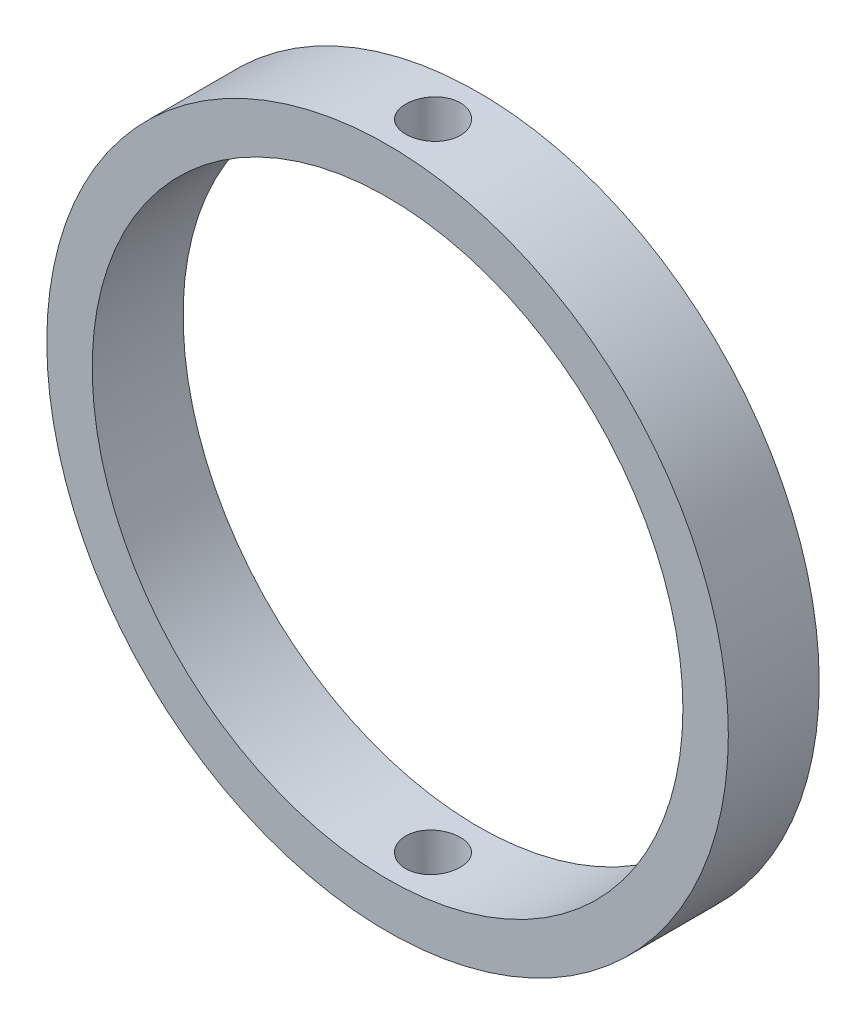
ISO-10303-21;
HEADER;
FILE_DESCRIPTION(('STEP AP214'),'2;1');
FILE_NAME('part.step','',(''),(''),'','','');
FILE_SCHEMA(('AUTOMOTIVE_DESIGN { 1 0 10303 214 1 1 1 1 }'));
ENDSEC;
DATA;
#1=APPLICATION_CONTEXT('core data for automotive mechanical design processes');
#2=APPLICATION_PROTOCOL_DEFINITION('international standard','automotive_design',2000,#1);
#3=PRODUCT_CONTEXT('',#1,'mechanical');
#4=PRODUCT('Part','Part','',(#3));
#5=PRODUCT_RELATED_PRODUCT_CATEGORY('part','',(#4));
#6=PRODUCT_DEFINITION_FORMATION('','',#4);
#7=PRODUCT_DEFINITION_CONTEXT('part definition',#1,'design');
#8=PRODUCT_DEFINITION('design','',#6,#7);
#9=PRODUCT_DEFINITION_SHAPE('','',#8);
#10=(LENGTH_UNIT() NAMED_UNIT(*) SI_UNIT(.MILLI.,.METRE.));
#11=(NAMED_UNIT(*) PLANE_ANGLE_UNIT() SI_UNIT($,.RADIAN.));
#12=(NAMED_UNIT(*) SI_UNIT($,.STERADIAN.) SOLID_ANGLE_UNIT());
#13=UNCERTAINTY_MEASURE_WITH_UNIT(LENGTH_MEASURE(1.E-05),#10,'distance_accuracy_value','');
#14=(GEOMETRIC_REPRESENTATION_CONTEXT(3) GLOBAL_UNCERTAINTY_ASSIGNED_CONTEXT((#13)) GLOBAL_UNIT_ASSIGNED_CONTEXT((#10,
#11,#12)) REPRESENTATION_CONTEXT('',''));
#15=CARTESIAN_POINT('',(0.,0.,0.));
#16=DIRECTION('',(0.,0.,1.));
#17=DIRECTION('',(1.,0.,0.));
#18=AXIS2_PLACEMENT_3D('',#15,#16,#17);
#19=CARTESIAN_POINT('',(0.,0.,12.7));
#20=DIRECTION('',(0.,0.,-1.));
#21=DIRECTION('',(-1.,0.,0.));
#22=AXIS2_PLACEMENT_3D('',#19,#20,#21);
#23=CYLINDRICAL_SURFACE('',#22,47.625);
#24=CARTESIAN_POINT('',(0.,0.,0.));
#25=DIRECTION('',(0.,0.,1.));
#26=DIRECTION('',(1.,0.,0.));
#27=AXIS2_PLACEMENT_3D('',#24,#25,#26);
#28=CIRCLE('',#27,47.625);
#29=CARTESIAN_POINT('',(47.625,0.,0.));
#30=VERTEX_POINT('',#29);
#31=EDGE_CURVE('E37',#30,#30,#28,.T.);
#32=ORIENTED_EDGE('',*,*,#31,.T.);
#33=EDGE_LOOP('',(#32));
#34=FACE_BOUND('',#33,.T.);
#35=CARTESIAN_POINT('',(0.,0.,12.7));
#36=DIRECTION('',(0.,0.,1.));
#37=DIRECTION('',(1.,0.,0.));
#38=AXIS2_PLACEMENT_3D('',#35,#36,#37);
#39=CIRCLE('',#38,47.625);
#40=CARTESIAN_POINT('',(47.625,0.,12.7));
#41=VERTEX_POINT('',#40);
#42=EDGE_CURVE('E10',#41,#41,#39,.T.);
#43=ORIENTED_EDGE('',*,*,#42,.F.);
#44=EDGE_LOOP('',(#43));
#45=FACE_BOUND('',#44,.T.);
#46=CARTESIAN_POINT('',(0.,47.625,10.16));
#47=CARTESIAN_POINT('',(-0.213642894787125,47.6249979979841,10.159990655507));
#48=CARTESIAN_POINT('',(-0.427431973417606,47.6235470821022,10.141969767916));
#49=CARTESIAN_POINT('',(-0.849097153173794,47.6178985898439,10.0703450256546));
#50=CARTESIAN_POINT('',(-1.05696624116746,47.6136978865188,10.0167006603788));
#51=CARTESIAN_POINT('',(-1.46062324082589,47.6030246111872,9.87538827367937));
#52=CARTESIAN_POINT('',(-1.65641783485151,47.5965533093033,9.78773927080609));
#53=CARTESIAN_POINT('',(-2.03046819214328,47.5820649376697,9.58093911568048));
#54=CARTESIAN_POINT('',(-2.20872774291331,47.5740482028397,9.46179478689229));
#55=CARTESIAN_POINT('',(-2.54311632738911,47.5573476571018,9.19508175371789));
#56=CARTESIAN_POINT('',(-2.69919828803384,47.54866248587,9.04745411200698));
#57=CARTESIAN_POINT('',(-2.98439738652769,47.5316153863817,8.72808922918145));
#58=CARTESIAN_POINT('',(-3.11351335046897,47.5232534722105,8.55635093900457));
#59=CARTESIAN_POINT('',(-3.34127282256513,47.5077848027543,8.1933571416446));
#60=CARTESIAN_POINT('',(-3.43987525589513,47.500679744807,8.00207578364625));
#61=CARTESIAN_POINT('',(-3.6035462772653,47.4885444501541,7.60560595723772));
#62=CARTESIAN_POINT('',(-3.66861541587786,47.4835141793835,7.40041771722276));
#63=CARTESIAN_POINT('',(-3.76323699458277,47.4761091857927,6.98242807596891));
#64=CARTESIAN_POINT('',(-3.79286576020375,47.4737287569578,6.76964405551081));
#65=CARTESIAN_POINT('',(-3.81600130377318,47.4718748383924,6.34211072925357));
#66=CARTESIAN_POINT('',(-3.809508711382,47.4724012979897,6.12736145777745));
#67=CARTESIAN_POINT('',(-3.76064895909167,47.4762964967399,5.70251608997131));
#68=CARTESIAN_POINT('',(-3.71836468408417,47.4796586690028,5.49241039277012));
#69=CARTESIAN_POINT('',(-3.59925059542587,47.4888361421048,5.08228807071721));
#70=CARTESIAN_POINT('',(-3.52242046760853,47.4946514652533,4.88227153763665));
#71=CARTESIAN_POINT('',(-3.33630256423632,47.5080875388587,4.4977407463609));
#72=CARTESIAN_POINT('',(-3.2269775280989,47.5157103598589,4.31324459805363));
#73=CARTESIAN_POINT('',(-2.97900002678632,47.5319005655513,3.96518977557274));
#74=CARTESIAN_POINT('',(-2.84034701491971,47.5404679678497,3.80163149178498));
#75=CARTESIAN_POINT('',(-2.53718418638651,47.5576111823144,3.49961323182642));
#76=CARTESIAN_POINT('',(-2.37260270117798,47.5661869502958,3.36122518307973));
#77=CARTESIAN_POINT('',(-2.02250503715779,47.5823575892283,3.11403161190192));
#78=CARTESIAN_POINT('',(-1.83698884575605,47.5899524595896,3.0052261072618));
#79=CARTESIAN_POINT('',(-1.45024169725515,47.6033068361668,2.82029097710858));
#80=CARTESIAN_POINT('',(-1.24900924996424,47.609066168076,2.74416445462415));
#81=CARTESIAN_POINT('',(-0.836562942205612,47.6180984890639,2.62679818489493));
#82=CARTESIAN_POINT('',(-0.625349272720353,47.6213715256954,2.5855577704184));
#83=CARTESIAN_POINT('',(-0.199559663159313,47.625056363478,2.53922437173404));
#84=CARTESIAN_POINT('',(0.0150053988434419,47.6254760299652,2.53403201993729));
#85=CARTESIAN_POINT('',(0.44195504374136,47.6234278333029,2.55968195113089));
#86=CARTESIAN_POINT('',(0.654339645342711,47.6209599949463,2.59052392472145));
#87=CARTESIAN_POINT('',(1.07061683146403,47.6134194336939,2.6872846719453));
#88=CARTESIAN_POINT('',(1.27452016951732,47.6083501252812,2.75315747099822));
#89=CARTESIAN_POINT('',(1.66837965337139,47.5961762410819,2.91806307361324));
#90=CARTESIAN_POINT('',(1.85833559539873,47.5890716355667,3.01709636153733));
#91=CARTESIAN_POINT('',(2.21936085022204,47.5736043044338,3.24576204361697));
#92=CARTESIAN_POINT('',(2.39038828992327,47.5652388824849,3.37546036326946));
#93=CARTESIAN_POINT('',(2.70827922349755,47.5481991250699,3.66167908859492));
#94=CARTESIAN_POINT('',(2.85514233034459,47.5395247846587,3.81819992378649));
#95=CARTESIAN_POINT('',(3.12087578562832,47.5228216402752,4.15405138255933));
#96=CARTESIAN_POINT('',(3.23968135798077,47.5147943577399,4.33343334459906));
#97=CARTESIAN_POINT('',(3.44548333852396,47.5003153513619,4.70965908470272));
#98=CARTESIAN_POINT('',(3.53248004288166,47.4938636128497,4.90650270016298));
#99=CARTESIAN_POINT('',(3.67208409848263,47.4832744544684,5.31183342317947));
#100=CARTESIAN_POINT('',(3.72473130204982,47.4791343534426,5.52030673189705));
#101=CARTESIAN_POINT('',(3.79427172073615,47.473628079374,5.94316848331289));
#102=CARTESIAN_POINT('',(3.81116556264339,47.4722618577026,6.15755682224868));
#103=CARTESIAN_POINT('',(3.80871270514706,47.4724586653317,6.58551916468683));
#104=CARTESIAN_POINT('',(3.78946779116593,47.4740134675244,6.79909376274323));
#105=CARTESIAN_POINT('',(3.71549574253772,47.4798596626636,7.21996740254844));
#106=CARTESIAN_POINT('',(3.66076855165724,47.4841510599472,7.42726643435099));
#107=CARTESIAN_POINT('',(3.51741077963534,47.4949847620385,7.82971254244472));
#108=CARTESIAN_POINT('',(3.42878180678283,47.5015269600675,8.0248601946826));
#109=CARTESIAN_POINT('',(3.2201480256733,47.5161252533925,8.3975223868188));
#110=CARTESIAN_POINT('',(3.1001437668899,47.5241813221754,8.5750372354443));
#111=CARTESIAN_POINT('',(2.8317838775222,47.5409265475311,8.90791527937007));
#112=CARTESIAN_POINT('',(2.68335306666853,47.5496173442055,9.06321778280078));
#113=CARTESIAN_POINT('',(2.36248604269522,47.5666378788449,9.34676537670226));
#114=CARTESIAN_POINT('',(2.19004401862018,47.574967528767,9.47500389846098));
#115=CARTESIAN_POINT('',(1.82574204396351,47.5903410785198,9.70094101362486));
#116=CARTESIAN_POINT('',(1.63384868904573,47.597382706198,9.79858585001621));
#117=CARTESIAN_POINT('',(1.23646677980119,47.6093596469371,9.96014557175655));
#118=CARTESIAN_POINT('',(1.03099421560101,47.6142973881141,10.0240993605452));
#119=CARTESIAN_POINT('',(0.686917717703781,47.6202378715826,10.1001137166647));
#120=CARTESIAN_POINT('',(0.550528733449827,47.6220155748099,10.1225413699192));
#121=CARTESIAN_POINT('',(0.27611352025576,47.6243972845999,10.1524875134838));
#122=CARTESIAN_POINT('',(0.138087295268101,47.6250012939956,10.1600060397785));
#123=CARTESIAN_POINT('',(0.,47.625,10.16));
#124=B_SPLINE_CURVE_WITH_KNOTS('',3,(#46,#47,#48,#49,#50,#51,#52,#53,#54,#55,#56,#57,#58,#59,
#60,#61,#62,#63,#64,#65,#66,#67,#68,#69,#70,#71,#72,#73,#74,#75,#76,#77,#78,#79,#80,#81,#82,#83,
#84,#85,#86,#87,#88,#89,#90,#91,#92,#93,#94,#95,#96,#97,#98,#99,#100,#101,#102,#103,#104,#105,
#106,#107,#108,#109,#110,#111,#112,#113,#114,#115,#116,#117,#118,#119,#120,#121,#122,#123),
.UNSPECIFIED.,.T.,.F.,(4,2,2,2,2,2,2,2,2,2,2,2,2,2,2,2,2,2,2,2,2,2,2,2,2,2,2,2,2,2,2,2,2,2,2,2,
2,2,4),(0.,0.640424527335627,1.2815785880271,1.9223745715963,2.56303184029761,3.20502924842262,
3.84705459872905,4.48994046911095,5.13281578381997,5.77430407431454,6.41578118254708,
7.05577683606212,7.69577830993673,8.33651649717172,8.97726662921191,9.61981997088082,
10.2623736989816,10.9049884272022,11.5475908644946,12.1884212426633,12.8292461185412,
13.4692320416116,14.109227313108,14.7506111998477,15.3920053582585,16.0348661277306,
16.6777209114832,17.319828521927,17.9619248755627,18.6022154658505,19.242507070893,
19.8827683044877,20.5230183259744,21.1649856157674,21.8071085390142,22.4503535074144,
23.0928540763045,23.506791101159,23.9207271269334),.UNSPECIFIED.);
#125=CARTESIAN_POINT('',(0.,47.625,10.16));
#126=VERTEX_POINT('',#125);
#127=EDGE_CURVE('E49',#126,#126,#124,.T.);
#128=ORIENTED_EDGE('',*,*,#127,.T.);
#129=EDGE_LOOP('',(#128));
#130=FACE_BOUND('',#129,.T.);
#131=CARTESIAN_POINT('',(0.,-47.625,2.54));
#132=CARTESIAN_POINT('',(0.213642894787125,-47.6249979979841,2.54000934449304));
#133=CARTESIAN_POINT('',(0.427431973417606,-47.6235470821022,2.55803023208402));
#134=CARTESIAN_POINT('',(0.849097153173794,-47.6178985898439,2.62965497434542));
#135=CARTESIAN_POINT('',(1.05696624116746,-47.6136978865188,2.68329933962121));
#136=CARTESIAN_POINT('',(1.46062324082589,-47.6030246111872,2.82461172632063));
#137=CARTESIAN_POINT('',(1.65641783485151,-47.5965533093033,2.91226072919391));
#138=CARTESIAN_POINT('',(2.03046819214328,-47.5820649376697,3.11906088431951));
#139=CARTESIAN_POINT('',(2.20872774291331,-47.5740482028397,3.23820521310771));
#140=CARTESIAN_POINT('',(2.54311632738911,-47.5573476571018,3.5049182462821));
#141=CARTESIAN_POINT('',(2.69919828803385,-47.54866248587,3.65254588799302));
#142=CARTESIAN_POINT('',(2.98439738652769,-47.5316153863817,3.97191077081854));
#143=CARTESIAN_POINT('',(3.11351335046897,-47.5232534722105,4.14364906099542));
#144=CARTESIAN_POINT('',(3.34127282256513,-47.5077848027543,4.5066428583554));
#145=CARTESIAN_POINT('',(3.43987525589513,-47.500679744807,4.69792421635374));
#146=CARTESIAN_POINT('',(3.6035462772653,-47.4885444501541,5.09439404276227));
#147=CARTESIAN_POINT('',(3.66861541587786,-47.4835141793835,5.29958228277723));
#148=CARTESIAN_POINT('',(3.76323699458277,-47.4761091857927,5.71757192403109));
#149=CARTESIAN_POINT('',(3.79286576020375,-47.4737287569578,5.93035594448918));
#150=CARTESIAN_POINT('',(3.81600130377318,-47.4718748383924,6.35788927074642));
#151=CARTESIAN_POINT('',(3.809508711382,-47.4724012979897,6.57263854222254));
#152=CARTESIAN_POINT('',(3.76064895909167,-47.4762964967399,6.99748391002869));
#153=CARTESIAN_POINT('',(3.71836468408417,-47.4796586690028,7.20758960722987));
#154=CARTESIAN_POINT('',(3.59925059542587,-47.4888361421048,7.61771192928279));
#155=CARTESIAN_POINT('',(3.52242046760853,-47.4946514652533,7.81772846236335));
#156=CARTESIAN_POINT('',(3.33630256423632,-47.5080875388587,8.20225925363909));
#157=CARTESIAN_POINT('',(3.2269775280989,-47.5157103598589,8.38675540194636));
#158=CARTESIAN_POINT('',(2.97900002678632,-47.5319005655513,8.73481022442726));
#159=CARTESIAN_POINT('',(2.84034701491971,-47.5404679678497,8.89836850821502));
#160=CARTESIAN_POINT('',(2.53718418638651,-47.5576111823144,9.20038676817357));
#161=CARTESIAN_POINT('',(2.37260270117798,-47.5661869502958,9.33877481692027));
#162=CARTESIAN_POINT('',(2.02250503715779,-47.5823575892283,9.58596838809807));
#163=CARTESIAN_POINT('',(1.83698884575605,-47.5899524595896,9.69477389273819));
#164=CARTESIAN_POINT('',(1.45024169725516,-47.6033068361668,9.87970902289141));
#165=CARTESIAN_POINT('',(1.24900924996424,-47.609066168076,9.95583554537585));
#166=CARTESIAN_POINT('',(0.836562942205616,-47.6180984890639,10.0732018151051));
#167=CARTESIAN_POINT('',(0.625349272720357,-47.6213715256954,10.1144422295816));
#168=CARTESIAN_POINT('',(0.199559663159317,-47.625056363478,10.160775628266));
#169=CARTESIAN_POINT('',(-0.0150053988434381,-47.6254760299652,10.1659679800627));
#170=CARTESIAN_POINT('',(-0.441955043741356,-47.6234278333029,10.1403180488691));
#171=CARTESIAN_POINT('',(-0.654339645342707,-47.6209599949463,10.1094760752786));
#172=CARTESIAN_POINT('',(-1.07061683146402,-47.6134194336939,10.0127153280547));
#173=CARTESIAN_POINT('',(-1.27452016951731,-47.6083501252812,9.94684252900178));
#174=CARTESIAN_POINT('',(-1.66837965337139,-47.5961762410819,9.78193692638676));
#175=CARTESIAN_POINT('',(-1.85833559539872,-47.5890716355667,9.68290363846266));
#176=CARTESIAN_POINT('',(-2.21936085022203,-47.5736043044338,9.45423795638303));
#177=CARTESIAN_POINT('',(-2.39038828992327,-47.5652388824849,9.32453963673054));
#178=CARTESIAN_POINT('',(-2.70827922349755,-47.5481991250699,9.03832091140507));
#179=CARTESIAN_POINT('',(-2.85514233034459,-47.5395247846587,8.8818000762135));
#180=CARTESIAN_POINT('',(-3.12087578562832,-47.5228216402752,8.54594861744067));
#181=CARTESIAN_POINT('',(-3.23968135798077,-47.5147943577399,8.36656665540094));
#182=CARTESIAN_POINT('',(-3.44548333852396,-47.5003153513619,7.99034091529727));
#183=CARTESIAN_POINT('',(-3.53248004288165,-47.4938636128497,7.79349729983702));
#184=CARTESIAN_POINT('',(-3.67208409848262,-47.4832744544684,7.38816657682053));
#185=CARTESIAN_POINT('',(-3.72473130204981,-47.4791343534426,7.17969326810295));
#186=CARTESIAN_POINT('',(-3.79427172073615,-47.473628079374,6.75683151668711));
#187=CARTESIAN_POINT('',(-3.81116556264339,-47.4722618577026,6.54244317775132));
#188=CARTESIAN_POINT('',(-3.80871270514706,-47.4724586653317,6.11448083531316));
#189=CARTESIAN_POINT('',(-3.78946779116593,-47.4740134675244,5.90090623725677));
#190=CARTESIAN_POINT('',(-3.71549574253772,-47.4798596626636,5.48003259745156));
#191=CARTESIAN_POINT('',(-3.66076855165724,-47.4841510599472,5.27273356564901));
#192=CARTESIAN_POINT('',(-3.51741077963534,-47.4949847620385,4.87028745755528));
#193=CARTESIAN_POINT('',(-3.42878180678283,-47.5015269600675,4.6751398053174));
#194=CARTESIAN_POINT('',(-3.2201480256733,-47.5161252533925,4.3024776131812));
#195=CARTESIAN_POINT('',(-3.1001437668899,-47.5241813221754,4.1249627645557));
#196=CARTESIAN_POINT('',(-2.8317838775222,-47.5409265475311,3.79208472062992));
#197=CARTESIAN_POINT('',(-2.68335306666853,-47.5496173442055,3.63678221719922));
#198=CARTESIAN_POINT('',(-2.36248604269522,-47.5666378788449,3.35323462329774));
#199=CARTESIAN_POINT('',(-2.19004401862018,-47.574967528767,3.22499610153901));
#200=CARTESIAN_POINT('',(-1.82574204396351,-47.5903410785198,2.99905898637514));
#201=CARTESIAN_POINT('',(-1.63384868904573,-47.597382706198,2.90141414998379));
#202=CARTESIAN_POINT('',(-1.23646677980119,-47.6093596469371,2.73985442824345));
#203=CARTESIAN_POINT('',(-1.03099421560101,-47.6142973881141,2.67590063945484));
#204=CARTESIAN_POINT('',(-0.686917717703782,-47.6202378715826,2.59988628333533));
#205=CARTESIAN_POINT('',(-0.550528733449828,-47.6220155748099,2.57745863008081));
#206=CARTESIAN_POINT('',(-0.27611352025576,-47.6243972845999,2.54751248651622));
#207=CARTESIAN_POINT('',(-0.138087295268101,-47.6250012939956,2.53999396022146));
#208=CARTESIAN_POINT('',(0.,-47.625,2.54));
#209=B_SPLINE_CURVE_WITH_KNOTS('',3,(#131,#132,#133,#134,#135,#136,#137,#138,#139,#140,#141,
#142,#143,#144,#145,#146,#147,#148,#149,#150,#151,#152,#153,#154,#155,#156,#157,#158,#159,#160,
#161,#162,#163,#164,#165,#166,#167,#168,#169,#170,#171,#172,#173,#174,#175,#176,#177,#178,#179,
#180,#181,#182,#183,#184,#185,#186,#187,#188,#189,#190,#191,#192,#193,#194,#195,#196,#197,#198,
#199,#200,#201,#202,#203,#204,#205,#206,#207,#208),.UNSPECIFIED.,.T.,.F.,(4,2,2,2,2,2,2,2,2,2,2,
2,2,2,2,2,2,2,2,2,2,2,2,2,2,2,2,2,2,2,2,2,2,2,2,2,2,2,4),(0.,0.640424527335627,1.2815785880271,
1.9223745715963,2.56303184029762,3.20502924842262,3.84705459872905,4.48994046911095,
5.13281578381997,5.77430407431453,6.41578118254708,7.05577683606212,7.69577830993674,
8.33651649717172,8.97726662921191,9.61981997088082,10.2623736989816,10.9049884272022,
11.5475908644946,12.1884212426633,12.8292461185412,13.4692320416116,14.109227313108,
14.7506111998477,15.3920053582585,16.0348661277306,16.6777209114832,17.319828521927,
17.9619248755627,18.6022154658505,19.242507070893,19.8827683044877,20.5230183259744,
21.1649856157674,21.8071085390142,22.4503535074144,23.0928540763045,23.506791101159,
23.9207271269334),.UNSPECIFIED.);
#210=CARTESIAN_POINT('',(0.,-47.625,2.54));
#211=VERTEX_POINT('',#210);
#212=EDGE_CURVE('E94',#211,#211,#209,.T.);
#213=ORIENTED_EDGE('',*,*,#212,.F.);
#214=EDGE_LOOP('',(#213));
#215=FACE_BOUND('',#214,.T.);
#216=ADVANCED_FACE('F33',(#34,#45,#130,#215),#23,.T.);
#217=CARTESIAN_POINT('',(0.,0.,12.7));
#218=DIRECTION('',(0.,0.,-1.));
#219=DIRECTION('',(-1.,0.,0.));
#220=AXIS2_PLACEMENT_3D('',#217,#218,#219);
#221=CYLINDRICAL_SURFACE('',#220,41.275);
#222=CARTESIAN_POINT('',(0.,0.,0.));
#223=DIRECTION('',(0.,0.,1.));
#224=DIRECTION('',(1.,0.,0.));
#225=AXIS2_PLACEMENT_3D('',#222,#223,#224);
#226=CIRCLE('',#225,41.275);
#227=CARTESIAN_POINT('',(41.275,0.,0.));
#228=VERTEX_POINT('',#227);
#229=EDGE_CURVE('E46',#228,#228,#226,.T.);
#230=ORIENTED_EDGE('',*,*,#229,.F.);
#231=EDGE_LOOP('',(#230));
#232=FACE_BOUND('',#231,.T.);
#233=CARTESIAN_POINT('',(0.,0.,12.7));
#234=DIRECTION('',(0.,0.,1.));
#235=DIRECTION('',(1.,0.,0.));
#236=AXIS2_PLACEMENT_3D('',#233,#234,#235);
#237=CIRCLE('',#236,41.275);
#238=CARTESIAN_POINT('',(41.275,0.,12.7));
#239=VERTEX_POINT('',#238);
#240=EDGE_CURVE('E44',#239,#239,#237,.T.);
#241=ORIENTED_EDGE('',*,*,#240,.T.);
#242=EDGE_LOOP('',(#241));
#243=FACE_BOUND('',#242,.T.);
#244=CARTESIAN_POINT('',(0.,41.275,10.16));
#245=CARTESIAN_POINT('',(0.213521858780794,41.2749977145689,10.1599907137189));
#246=CARTESIAN_POINT('',(0.427186915439905,41.2733254948798,10.1419901517407));
#247=CARTESIAN_POINT('',(0.84859918291113,41.2668154676594,10.0704508626402));
#248=CARTESIAN_POINT('',(1.05633951393487,41.261974124786,10.0168724453777));
#249=CARTESIAN_POINT('',(1.45973842453066,41.2496726398541,9.87574542604965));
#250=CARTESIAN_POINT('',(1.65540400079619,41.2422140314417,9.78821671477131));
#251=CARTESIAN_POINT('',(2.02922156873217,41.225513198018,9.58171090182706));
#252=CARTESIAN_POINT('',(2.20737715997308,41.216271340756,9.46274028237991));
#253=CARTESIAN_POINT('',(2.54171294269293,41.1970081940127,9.19633208881864));
#254=CARTESIAN_POINT('',(2.69783146850316,41.1869848346024,9.04881726840384));
#255=CARTESIAN_POINT('',(2.98313188420894,41.1673056148925,8.72967221030308));
#256=CARTESIAN_POINT('',(3.11231255901729,41.1576497711864,8.55804088537678));
#257=CARTESIAN_POINT('',(3.34028446769979,41.1397772349661,8.1951543667363));
#258=CARTESIAN_POINT('',(3.4390206096173,41.1315631628914,8.00386442313444));
#259=CARTESIAN_POINT('',(3.60294886599402,41.1175290263817,7.60733222165949));
#260=CARTESIAN_POINT('',(3.66814169444251,41.1117089109905,7.40209026086863));
#261=CARTESIAN_POINT('',(3.76295165537002,41.1031398178567,6.98410427293283));
#262=CARTESIAN_POINT('',(3.79267028745292,41.1003820795546,6.77138345108664));
#263=CARTESIAN_POINT('',(3.81600191539454,41.0982225764614,6.34395654181241));
#264=CARTESIAN_POINT('',(3.8096157287165,41.0988207356882,6.12925049944241));
#265=CARTESIAN_POINT('',(3.76100276410609,41.1032974592562,5.70464554622001));
#266=CARTESIAN_POINT('',(3.71888655965188,41.107165902937,5.49473385416215));
#267=CARTESIAN_POINT('',(3.60018100705346,41.1177314823507,5.08497136585105));
#268=CARTESIAN_POINT('',(3.52359125544222,41.1244286511899,4.88512068737902));
#269=CARTESIAN_POINT('',(3.33798981143535,41.1399087323314,4.50080246205531));
#270=CARTESIAN_POINT('',(3.22892879455928,41.1486948136119,4.31635886864129));
#271=CARTESIAN_POINT('',(2.98151615821919,41.1673599602072,3.96835252373304));
#272=CARTESIAN_POINT('',(2.84316380914812,41.1772390527445,3.80479029252771));
#273=CARTESIAN_POINT('',(2.54047698752356,41.1970221681213,3.50254687700635));
#274=CARTESIAN_POINT('',(2.37604697344122,41.2069261454179,3.36396135338226));
#275=CARTESIAN_POINT('',(2.02620489734046,41.2256079566405,3.11634585145486));
#276=CARTESIAN_POINT('',(1.840792816749,41.2343857895697,3.00731589931404));
#277=CARTESIAN_POINT('',(1.45418548014535,41.249828566945,2.82191136223448));
#278=CARTESIAN_POINT('',(1.25298802719658,41.2564932166349,2.74554133233083));
#279=CARTESIAN_POINT('',(0.84055113908881,41.2669555344116,2.62769309482829));
#280=CARTESIAN_POINT('',(0.629311959856386,41.2707532755238,2.58621399849133));
#281=CARTESIAN_POINT('',(0.203616708150199,41.275044500696,2.53944573676703));
#282=CARTESIAN_POINT('',(-0.0108247386833753,41.2755500426869,2.53402450513421));
#283=CARTESIAN_POINT('',(-0.437565286262116,41.273232179619,2.55917942913952));
#284=CARTESIAN_POINT('',(-0.649864411575162,41.2704088127795,2.58975517149455));
#285=CARTESIAN_POINT('',(-1.06591497660756,41.26175825637,2.68592659550021));
#286=CARTESIAN_POINT('',(-1.26968075953517,41.2559363456238,2.75146074141146));
#287=CARTESIAN_POINT('',(-1.66332557385129,41.2419422565534,2.91562564839807));
#288=CARTESIAN_POINT('',(-1.85320433782513,41.2337700329854,3.01425704660471));
#289=CARTESIAN_POINT('',(-2.21428415645052,41.2159603358432,3.24214630834595));
#290=CARTESIAN_POINT('',(-2.3854300199617,41.2063187227295,3.37149129102912));
#291=CARTESIAN_POINT('',(-2.70362791390356,41.1866663510888,3.65701072820416));
#292=CARTESIAN_POINT('',(-2.8506794300267,41.1766555846875,3.81318575525285));
#293=CARTESIAN_POINT('',(-3.11697025119252,41.1573571790123,4.14850677283373));
#294=CARTESIAN_POINT('',(-3.23612311866305,41.1480718450223,4.32772155785971));
#295=CARTESIAN_POINT('',(-3.44264086745014,41.1313096042156,4.70369402606964));
#296=CARTESIAN_POINT('',(-3.53000612727544,41.1238326758658,4.9004515003305));
#297=CARTESIAN_POINT('',(-3.67032274652405,41.1115475689737,5.30562303597096));
#298=CARTESIAN_POINT('',(-3.72332625271892,41.1067353481465,5.51401891057709));
#299=CARTESIAN_POINT('',(-3.79358427463847,41.1003115286657,5.93679890742416));
#300=CARTESIAN_POINT('',(-3.81083965098089,41.0986998529609,6.15118288537867));
#301=CARTESIAN_POINT('',(-3.80910063504376,41.0988609992784,6.5789944671413));
#302=CARTESIAN_POINT('',(-3.79024203655333,41.1006211427796,6.79242264077584));
#303=CARTESIAN_POINT('',(-3.71709436256807,41.1073006181969,7.21306584650784));
#304=CARTESIAN_POINT('',(-3.66280523986343,41.1122199543224,7.42028087032614));
#305=CARTESIAN_POINT('',(-3.52037360983846,41.124660103351,7.82261936626896));
#306=CARTESIAN_POINT('',(-3.43223436284622,41.1321806657058,8.01774400079706));
#307=CARTESIAN_POINT('',(-3.22461891779186,41.1489763781323,8.39045022281649));
#308=CARTESIAN_POINT('',(-3.10514304770787,41.1582515098398,8.56803199388972));
#309=CARTESIAN_POINT('',(-2.83773531104904,41.1775529538459,8.90130731198625));
#310=CARTESIAN_POINT('',(-2.68970247915845,41.1875818519778,9.056919699383));
#311=CARTESIAN_POINT('',(-2.36957627925046,41.2072371503056,9.34115878763462));
#312=CARTESIAN_POINT('',(-2.19747712894599,41.2168634530478,9.46977898459156));
#313=CARTESIAN_POINT('',(-1.83369927544946,41.2346502798864,9.69659690116698));
#314=CARTESIAN_POINT('',(-1.64197839463909,41.2428075378412,9.79472717489748));
#315=CARTESIAN_POINT('',(-1.2448319210582,41.2567005005864,9.95727441140706));
#316=CARTESIAN_POINT('',(-1.03942222851751,41.2624389600525,10.02172974542));
#317=CARTESIAN_POINT('',(-0.694021363485044,41.2693906974489,10.0988587513412));
#318=CARTESIAN_POINT('',(-0.556244833127425,41.2714844901459,10.1217558070424));
#319=CARTESIAN_POINT('',(-0.278999247640383,41.2742898858105,10.1523294397411));
#320=CARTESIAN_POINT('',(-0.139530198247238,41.2750014934614,10.1600060683091));
#321=CARTESIAN_POINT('',(0.,41.275,10.16));
#322=B_SPLINE_CURVE_WITH_KNOTS('',3,(#244,#245,#246,#247,#248,#249,#250,#251,#252,#253,#254,
#255,#256,#257,#258,#259,#260,#261,#262,#263,#264,#265,#266,#267,#268,#269,#270,#271,#272,#273,
#274,#275,#276,#277,#278,#279,#280,#281,#282,#283,#284,#285,#286,#287,#288,#289,#290,#291,#292,
#293,#294,#295,#296,#297,#298,#299,#300,#301,#302,#303,#304,#305,#306,#307,#308,#309,#310,#311,
#312,#313,#314,#315,#316,#317,#318,#319,#320,#321),.UNSPECIFIED.,.T.,.F.,(4,2,2,2,2,2,2,2,2,2,2,
2,2,2,2,2,2,2,2,2,2,2,2,2,2,2,2,2,2,2,2,2,2,2,2,2,2,2,4),(0.,0.640056100574769,1.28082744076166,
1.92122393172732,2.56148849825006,3.20351061303111,3.84556168127986,4.48876786748697,
5.13196036210325,5.77330809391858,6.4146413047887,7.05399699517268,7.69336016855924,
8.3336995454953,8.97405487428687,9.61681292556429,10.2595715458072,10.9024197815113,
11.5452516421591,12.1857277514441,12.8261965074618,13.4655415768094,14.1048989544326,
14.7460920025889,15.3872987355926,16.0304665623748,16.6736267304302,17.3158085512295,
17.9579749116536,18.5977313737407,19.2374886882806,19.8771843990332,20.5168734148134,
21.1588669832238,21.8010150659051,22.4445736760442,23.087397368948,23.5056564535613,
23.9239141210081),.UNSPECIFIED.);
#323=CARTESIAN_POINT('',(0.,41.275,10.16));
#324=VERTEX_POINT('',#323);
#325=EDGE_CURVE('E57',#324,#324,#322,.T.);
#326=ORIENTED_EDGE('',*,*,#325,.T.);
#327=EDGE_LOOP('',(#326));
#328=FACE_BOUND('',#327,.T.);
#329=CARTESIAN_POINT('',(0.,-41.275,2.54));
#330=CARTESIAN_POINT('',(-0.213521858780793,-41.2749977145689,2.54000928628112));
#331=CARTESIAN_POINT('',(-0.427186915439904,-41.2733254948798,2.55800984825928));
#332=CARTESIAN_POINT('',(-0.848599182911129,-41.2668154676594,2.62954913735975));
#333=CARTESIAN_POINT('',(-1.05633951393487,-41.261974124786,2.68312755462234));
#334=CARTESIAN_POINT('',(-1.45973842453066,-41.2496726398541,2.82425457395035));
#335=CARTESIAN_POINT('',(-1.65540400079618,-41.2422140314417,2.91178328522869));
#336=CARTESIAN_POINT('',(-2.02922156873217,-41.225513198018,3.11828909817293));
#337=CARTESIAN_POINT('',(-2.20737715997308,-41.216271340756,3.23725971762008));
#338=CARTESIAN_POINT('',(-2.54171294269293,-41.1970081940127,3.50366791118135));
#339=CARTESIAN_POINT('',(-2.69783146850316,-41.1869848346024,3.65118273159615));
#340=CARTESIAN_POINT('',(-2.98313188420894,-41.1673056148925,3.97032778969692));
#341=CARTESIAN_POINT('',(-3.11231255901728,-41.1576497711864,4.14195911462322));
#342=CARTESIAN_POINT('',(-3.34028446769979,-41.1397772349661,4.50484563326369));
#343=CARTESIAN_POINT('',(-3.4390206096173,-41.1315631628914,4.69613557686555));
#344=CARTESIAN_POINT('',(-3.60294886599402,-41.1175290263817,5.09266777834051));
#345=CARTESIAN_POINT('',(-3.66814169444251,-41.1117089109905,5.29790973913136));
#346=CARTESIAN_POINT('',(-3.76295165537002,-41.1031398178567,5.71589572706717));
#347=CARTESIAN_POINT('',(-3.79267028745292,-41.1003820795546,5.92861654891336));
#348=CARTESIAN_POINT('',(-3.81600191539454,-41.0982225764614,6.35604345818759));
#349=CARTESIAN_POINT('',(-3.8096157287165,-41.0988207356882,6.57074950055759));
#350=CARTESIAN_POINT('',(-3.76100276410608,-41.1032974592562,6.99535445377999));
#351=CARTESIAN_POINT('',(-3.71888655965188,-41.107165902937,7.20526614583785));
#352=CARTESIAN_POINT('',(-3.60018100705345,-41.1177314823507,7.61502863414895));
#353=CARTESIAN_POINT('',(-3.52359125544222,-41.1244286511899,7.81487931262097));
#354=CARTESIAN_POINT('',(-3.33798981143535,-41.1399087323314,8.19919753794469));
#355=CARTESIAN_POINT('',(-3.22892879455928,-41.1486948136119,8.3836411313587));
#356=CARTESIAN_POINT('',(-2.98151615821919,-41.1673599602072,8.73164747626696));
#357=CARTESIAN_POINT('',(-2.84316380914812,-41.1772390527445,8.89520970747229));
#358=CARTESIAN_POINT('',(-2.54047698752355,-41.1970221681213,9.19745312299365));
#359=CARTESIAN_POINT('',(-2.37604697344121,-41.2069261454179,9.33603864661774));
#360=CARTESIAN_POINT('',(-2.02620489734046,-41.2256079566405,9.58365414854514));
#361=CARTESIAN_POINT('',(-1.840792816749,-41.2343857895697,9.69268410068596));
#362=CARTESIAN_POINT('',(-1.45418548014534,-41.249828566945,9.87808863776552));
#363=CARTESIAN_POINT('',(-1.25298802719657,-41.2564932166349,9.95445866766917));
#364=CARTESIAN_POINT('',(-0.840551139088804,-41.2669555344116,10.0723069051717));
#365=CARTESIAN_POINT('',(-0.629311959856382,-41.2707532755238,10.1137860015087));
#366=CARTESIAN_POINT('',(-0.203616708150196,-41.275044500696,10.160554263233));
#367=CARTESIAN_POINT('',(0.010824738683379,-41.2755500426869,10.1659754948658));
#368=CARTESIAN_POINT('',(0.43756528626212,-41.273232179619,10.1408205708605));
#369=CARTESIAN_POINT('',(0.649864411575166,-41.2704088127795,10.1102448285054));
#370=CARTESIAN_POINT('',(1.06591497660756,-41.26175825637,10.0140734044998));
#371=CARTESIAN_POINT('',(1.26968075953518,-41.2559363456238,9.94853925858854));
#372=CARTESIAN_POINT('',(1.66332557385129,-41.2419422565534,9.78437435160192));
#373=CARTESIAN_POINT('',(1.85320433782514,-41.2337700329854,9.68574295339529));
#374=CARTESIAN_POINT('',(2.21428415645052,-41.2159603358432,9.45785369165405));
#375=CARTESIAN_POINT('',(2.3854300199617,-41.2063187227295,9.32850870897087));
#376=CARTESIAN_POINT('',(2.70362791390356,-41.1866663510888,9.04298927179583));
#377=CARTESIAN_POINT('',(2.8506794300267,-41.1766555846875,8.88681424474715));
#378=CARTESIAN_POINT('',(3.11697025119252,-41.1573571790123,8.55149322716627));
#379=CARTESIAN_POINT('',(3.23612311866306,-41.1480718450223,8.37227844214028));
#380=CARTESIAN_POINT('',(3.44264086745015,-41.1313096042156,7.99630597393035));
#381=CARTESIAN_POINT('',(3.53000612727544,-41.1238326758658,7.7995484996695));
#382=CARTESIAN_POINT('',(3.67032274652405,-41.1115475689737,7.39437696402904));
#383=CARTESIAN_POINT('',(3.72332625271893,-41.1067353481465,7.18598108942291));
#384=CARTESIAN_POINT('',(3.79358427463847,-41.1003115286657,6.76320109257584));
#385=CARTESIAN_POINT('',(3.81083965098089,-41.0986998529609,6.54881711462132));
#386=CARTESIAN_POINT('',(3.80910063504376,-41.0988609992784,6.12100553285869));
#387=CARTESIAN_POINT('',(3.79024203655333,-41.1006211427796,5.90757735922415));
#388=CARTESIAN_POINT('',(3.71709436256807,-41.1073006181969,5.48693415349215));
#389=CARTESIAN_POINT('',(3.66280523986343,-41.1122199543224,5.27971912967385));
#390=CARTESIAN_POINT('',(3.52037360983846,-41.124660103351,4.87738063373103));
#391=CARTESIAN_POINT('',(3.43223436284622,-41.1321806657058,4.68225599920293));
#392=CARTESIAN_POINT('',(3.22461891779186,-41.1489763781323,4.3095497771835));
#393=CARTESIAN_POINT('',(3.10514304770787,-41.1582515098398,4.13196800611027));
#394=CARTESIAN_POINT('',(2.83773531104904,-41.1775529538459,3.79869268801375));
#395=CARTESIAN_POINT('',(2.68970247915845,-41.1875818519778,3.643080300617));
#396=CARTESIAN_POINT('',(2.36957627925046,-41.2072371503056,3.35884121236538));
#397=CARTESIAN_POINT('',(2.197477128946,-41.2168634530478,3.23022101540843));
#398=CARTESIAN_POINT('',(1.83369927544946,-41.2346502798864,3.00340309883302));
#399=CARTESIAN_POINT('',(1.6419783946391,-41.2428075378412,2.90527282510252));
#400=CARTESIAN_POINT('',(1.2448319210582,-41.2567005005864,2.74272558859294));
#401=CARTESIAN_POINT('',(1.03942222851751,-41.2624389600525,2.67827025458));
#402=CARTESIAN_POINT('',(0.694021363485044,-41.2693906974489,2.60114124865879));
#403=CARTESIAN_POINT('',(0.556244833127425,-41.2714844901459,2.57824419295759));
#404=CARTESIAN_POINT('',(0.278999247640384,-41.2742898858105,2.54767056025889));
#405=CARTESIAN_POINT('',(0.139530198247239,-41.2750014934614,2.53999393169087));
#406=CARTESIAN_POINT('',(0.,-41.275,2.54));
#407=B_SPLINE_CURVE_WITH_KNOTS('',3,(#329,#330,#331,#332,#333,#334,#335,#336,#337,#338,#339,
#340,#341,#342,#343,#344,#345,#346,#347,#348,#349,#350,#351,#352,#353,#354,#355,#356,#357,#358,
#359,#360,#361,#362,#363,#364,#365,#366,#367,#368,#369,#370,#371,#372,#373,#374,#375,#376,#377,
#378,#379,#380,#381,#382,#383,#384,#385,#386,#387,#388,#389,#390,#391,#392,#393,#394,#395,#396,
#397,#398,#399,#400,#401,#402,#403,#404,#405,#406),.UNSPECIFIED.,.T.,.F.,(4,2,2,2,2,2,2,2,2,2,2,
2,2,2,2,2,2,2,2,2,2,2,2,2,2,2,2,2,2,2,2,2,2,2,2,2,2,2,4),(0.,0.640056100574769,1.28082744076166,
1.92122393172732,2.56148849825006,3.20351061303111,3.84556168127986,4.48876786748697,
5.13196036210325,5.77330809391858,6.4146413047887,7.05399699517268,7.69336016855924,
8.3336995454953,8.97405487428688,9.6168129255643,10.2595715458072,10.9024197815113,
11.5452516421591,12.1857277514441,12.8261965074618,13.4655415768094,14.1048989544326,
14.7460920025889,15.3872987355926,16.0304665623748,16.6736267304302,17.3158085512295,
17.9579749116536,18.5977313737407,19.2374886882806,19.8771843990332,20.5168734148134,
21.1588669832238,21.8010150659051,22.4445736760442,23.087397368948,23.5056564535613,
23.9239141210081),.UNSPECIFIED.);
#408=CARTESIAN_POINT('',(0.,-41.275,2.54));
#409=VERTEX_POINT('',#408);
#410=EDGE_CURVE('E96',#409,#409,#407,.T.);
#411=ORIENTED_EDGE('',*,*,#410,.F.);
#412=EDGE_LOOP('',(#411));
#413=FACE_BOUND('',#412,.T.);
#414=ADVANCED_FACE('F71',(#232,#243,#328,#413),#221,.F.);
#415=CARTESIAN_POINT('',(0.,0.,12.7));
#416=DIRECTION('',(0.,0.,1.));
#417=DIRECTION('',(1.,0.,0.));
#418=AXIS2_PLACEMENT_3D('',#415,#416,#417);
#419=PLANE('',#418);
#420=ORIENTED_EDGE('',*,*,#42,.T.);
#421=EDGE_LOOP('',(#420));
#422=FACE_BOUND('',#421,.T.);
#423=ORIENTED_EDGE('',*,*,#240,.F.);
#424=EDGE_LOOP('',(#423));
#425=FACE_BOUND('',#424,.T.);
#426=ADVANCED_FACE('F75',(#422,#425),#419,.T.);
#427=CARTESIAN_POINT('',(0.,0.,0.));
#428=DIRECTION('',(0.,0.,1.));
#429=DIRECTION('',(1.,0.,0.));
#430=AXIS2_PLACEMENT_3D('',#427,#428,#429);
#431=PLANE('',#430);
#432=ORIENTED_EDGE('',*,*,#31,.F.);
#433=EDGE_LOOP('',(#432));
#434=FACE_BOUND('',#433,.T.);
#435=ORIENTED_EDGE('',*,*,#229,.T.);
#436=EDGE_LOOP('',(#435));
#437=FACE_BOUND('',#436,.T.);
#438=ADVANCED_FACE('F67',(#434,#437),#431,.F.);
#439=CARTESIAN_POINT('',(0.,-47.626,6.35));
#440=DIRECTION('',(0.,1.,0.));
#441=DIRECTION('',(0.,0.,1.));
#442=AXIS2_PLACEMENT_3D('',#439,#440,#441);
#443=CYLINDRICAL_SURFACE('',#442,3.81);
#444=ORIENTED_EDGE('',*,*,#325,.F.);
#445=EDGE_LOOP('',(#444));
#446=FACE_BOUND('',#445,.T.);
#447=ORIENTED_EDGE('',*,*,#127,.F.);
#448=EDGE_LOOP('',(#447));
#449=FACE_BOUND('',#448,.T.);
#450=ADVANCED_FACE('F62',(#446,#449),#443,.F.);
#451=CARTESIAN_POINT('',(0.,47.626,6.35));
#452=DIRECTION('',(0.,-1.,0.));
#453=DIRECTION('',(0.,0.,-1.));
#454=AXIS2_PLACEMENT_3D('',#451,#452,#453);
#455=CYLINDRICAL_SURFACE('',#454,3.81);
#456=ORIENTED_EDGE('',*,*,#410,.T.);
#457=EDGE_LOOP('',(#456));
#458=FACE_BOUND('',#457,.T.);
#459=ORIENTED_EDGE('',*,*,#212,.T.);
#460=EDGE_LOOP('',(#459));
#461=FACE_BOUND('',#460,.T.);
#462=ADVANCED_FACE('F66',(#458,#461),#455,.F.);
#463=CLOSED_SHELL('',(#216,#414,#426,#438,#450,#462));
#464=MANIFOLD_SOLID_BREP('B2',#463);
#465=ADVANCED_BREP_SHAPE_REPRESENTATION('',(#18,#464),#14);
#466=SHAPE_DEFINITION_REPRESENTATION(#9,#465);
ENDSEC;
END-ISO-10303-21;
